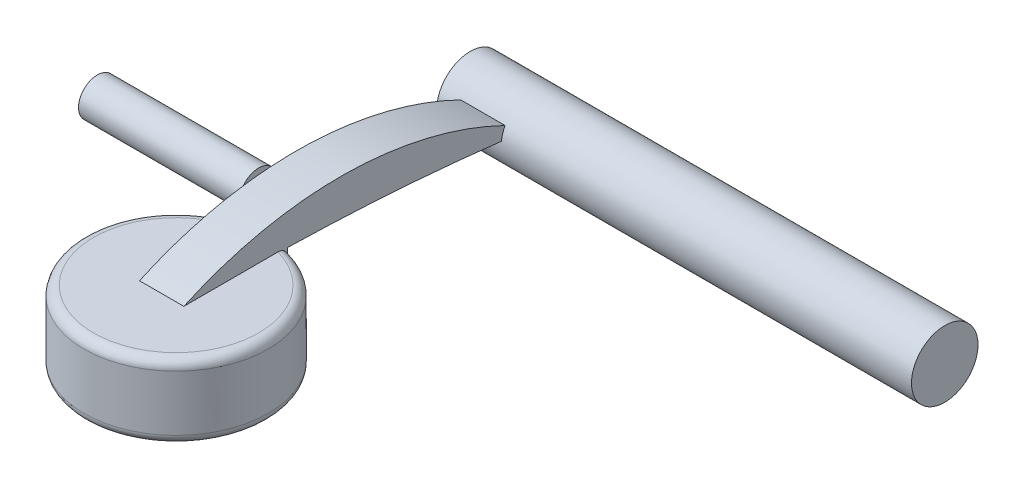
ISO-10303-21;
HEADER;
FILE_DESCRIPTION(('STEP AP214'),'2;1');
FILE_NAME('part.step','',(''),(''),'','','');
FILE_SCHEMA(('AUTOMOTIVE_DESIGN { 1 0 10303 214 1 1 1 1 }'));
ENDSEC;
DATA;
#1=APPLICATION_CONTEXT('core data for automotive mechanical design processes');
#2=APPLICATION_PROTOCOL_DEFINITION('international standard','automotive_design',2000,#1);
#3=PRODUCT_CONTEXT('',#1,'mechanical');
#4=PRODUCT('Part','Part','',(#3));
#5=PRODUCT_RELATED_PRODUCT_CATEGORY('part','',(#4));
#6=PRODUCT_DEFINITION_FORMATION('','',#4);
#7=PRODUCT_DEFINITION_CONTEXT('part definition',#1,'design');
#8=PRODUCT_DEFINITION('design','',#6,#7);
#9=PRODUCT_DEFINITION_SHAPE('','',#8);
#10=(LENGTH_UNIT() NAMED_UNIT(*) SI_UNIT(.MILLI.,.METRE.));
#11=(NAMED_UNIT(*) PLANE_ANGLE_UNIT() SI_UNIT($,.RADIAN.));
#12=(NAMED_UNIT(*) SI_UNIT($,.STERADIAN.) SOLID_ANGLE_UNIT());
#13=UNCERTAINTY_MEASURE_WITH_UNIT(LENGTH_MEASURE(1.E-05),#10,'distance_accuracy_value','');
#14=(GEOMETRIC_REPRESENTATION_CONTEXT(3) GLOBAL_UNCERTAINTY_ASSIGNED_CONTEXT((#13)) GLOBAL_UNIT_ASSIGNED_CONTEXT((#10,
#11,#12)) REPRESENTATION_CONTEXT('',''));
#15=CARTESIAN_POINT('',(0.,0.,0.));
#16=DIRECTION('',(0.,0.,1.));
#17=DIRECTION('',(1.,0.,0.));
#18=AXIS2_PLACEMENT_3D('',#15,#16,#17);
#19=CARTESIAN_POINT('',(4.3434,-21.7507796027201,13.1173010438083));
#20=DIRECTION('',(-1.,0.,0.));
#21=DIRECTION('',(0.,0.,1.));
#22=AXIS2_PLACEMENT_3D('',#19,#20,#21);
#23=CYLINDRICAL_SURFACE('',#22,25.4);
#24=DIRECTION('',(-1.,0.,0.));
#25=VECTOR('',#24,1.);
#26=CARTESIAN_POINT('',(4.34340000000016,1.34619999999997,23.6856279327502));
#27=LINE('',#26,#25);
#28=CARTESIAN_POINT('',(4.3434,1.34619999999996,23.6856279327502));
#29=VERTEX_POINT('',#28);
#30=CARTESIAN_POINT('',(1.3462,1.34619999999999,23.6856279327502));
#31=VERTEX_POINT('',#30);
#32=EDGE_CURVE('E127',#29,#31,#27,.T.);
#33=ORIENTED_EDGE('',*,*,#32,.F.);
#34=CARTESIAN_POINT('',(4.3434,-21.7507796027201,13.1173010438083));
#35=DIRECTION('',(1.,0.,0.));
#36=DIRECTION('',(0.,0.,-1.));
#37=AXIS2_PLACEMENT_3D('',#34,#35,#36);
#38=CIRCLE('',#37,25.4);
#39=CARTESIAN_POINT('',(4.3434,1.07456527479049,1.97442748162966));
#40=VERTEX_POINT('',#39);
#41=EDGE_CURVE('E144',#40,#29,#38,.T.);
#42=ORIENTED_EDGE('',*,*,#41,.F.);
#43=DIRECTION('',(-1.,0.,0.));
#44=VECTOR('',#43,1.);
#45=CARTESIAN_POINT('',(2.8448,1.0745652747905,1.97442748162966));
#46=LINE('',#45,#44);
#47=CARTESIAN_POINT('',(1.3462,1.0745652747905,1.97442748162966));
#48=VERTEX_POINT('',#47);
#49=EDGE_CURVE('E207',#40,#48,#46,.T.);
#50=ORIENTED_EDGE('',*,*,#49,.T.);
#51=CARTESIAN_POINT('',(1.3462,-21.7507796027201,13.1173010438083));
#52=DIRECTION('',(1.,0.,0.));
#53=DIRECTION('',(0.,0.,-1.));
#54=AXIS2_PLACEMENT_3D('',#51,#52,#53);
#55=CIRCLE('',#54,25.4);
#56=CARTESIAN_POINT('',(1.3462,3.59411581860612,14.7895079933323));
#57=VERTEX_POINT('',#56);
#58=EDGE_CURVE('E106',#48,#57,#55,.T.);
#59=ORIENTED_EDGE('',*,*,#58,.T.);
#60=CARTESIAN_POINT('',(1.3462,3.40039726745053,16.663891243619));
#61=VERTEX_POINT('',#60);
#62=EDGE_CURVE('E102',#57,#61,#55,.T.);
#63=ORIENTED_EDGE('',*,*,#62,.T.);
#64=EDGE_CURVE('E103',#61,#31,#55,.T.);
#65=ORIENTED_EDGE('',*,*,#64,.T.);
#66=EDGE_LOOP('',(#33,#42,#50,#59,#63,#65));
#67=FACE_BOUND('',#66,.T.);
#68=ADVANCED_FACE('F39',(#67),#23,.T.);
#69=CARTESIAN_POINT('',(4.3434,-151.081445800467,20.0039179872453));
#70=DIRECTION('',(-1.,0.,0.));
#71=DIRECTION('',(0.,0.,1.));
#72=AXIS2_PLACEMENT_3D('',#69,#70,#71);
#73=CYLINDRICAL_SURFACE('',#72,152.4);
#74=CARTESIAN_POINT('',(1.34620000000106,1.282033768533,16.667738491654));
#75=CARTESIAN_POINT('',(1.51765032495201,1.2810995876091,16.6251779736917));
#76=CARTESIAN_POINT('',(1.69092174834798,1.28031269019583,16.5899559722769));
#77=CARTESIAN_POINT('',(2.03989821390831,1.27905778264743,16.5343491572366));
#78=CARTESIAN_POINT('',(2.21560415329253,1.27858989345131,16.5139699704619));
#79=CARTESIAN_POINT('',(2.56457948471818,1.27800399390558,16.4884990793644));
#80=CARTESIAN_POINT('',(2.73782720326946,1.27787916434063,16.4831093927537));
#81=CARTESIAN_POINT('',(3.08408808934924,1.27796430758188,16.4867939584811));
#82=CARTESIAN_POINT('',(3.25710133065433,1.27817411403033,16.4958610239272));
#83=CARTESIAN_POINT('',(3.58271564193875,1.27887843722038,16.5265877311974));
#84=CARTESIAN_POINT('',(3.73546041971656,1.27933894465162,16.5467457538455));
#85=CARTESIAN_POINT('',(4.04041434459244,1.28050512953281,16.5985570928081));
#86=CARTESIAN_POINT('',(4.1926060371779,1.28121299499684,16.6303131167953));
#87=CARTESIAN_POINT('',(4.34340000000104,1.282033768533,16.6677384916542));
#88=B_SPLINE_CURVE_WITH_KNOTS('',3,(#74,#75,#76,#77,#78,#79,#80,#81,#82,#83,#84,#85,#86,#87),
.UNSPECIFIED.,.F.,.F.,(4,2,2,2,2,2,4),(0.,0.529808905443831,1.05981855489802,1.57921393637987,
2.09835119108104,2.56014411099233,3.02612979371629),.UNSPECIFIED.);
#89=CARTESIAN_POINT('',(1.34620000000106,1.282033768533,16.667738491654));
#90=VERTEX_POINT('',#89);
#91=CARTESIAN_POINT('',(4.34340000000106,1.282033768533,16.667738491654));
#92=VERTEX_POINT('',#91);
#93=EDGE_CURVE('E117',#90,#92,#88,.T.);
#94=ORIENTED_EDGE('',*,*,#93,.F.);
#95=CARTESIAN_POINT('',(1.3462,-151.081445800467,20.0039179872453));
#96=DIRECTION('',(-1.,0.,0.));
#97=DIRECTION('',(0.,0.,-1.));
#98=AXIS2_PLACEMENT_3D('',#95,#96,#97);
#99=CIRCLE('',#98,152.4);
#100=CARTESIAN_POINT('',(1.3462,0.278614937488098,2.23056677250751));
#101=VERTEX_POINT('',#100);
#102=EDGE_CURVE('E227',#90,#101,#99,.T.);
#103=ORIENTED_EDGE('',*,*,#102,.T.);
#104=DIRECTION('',(-1.,0.,0.));
#105=VECTOR('',#104,1.);
#106=CARTESIAN_POINT('',(2.84480000000001,0.278614937487931,2.23056677250617));
#107=LINE('',#106,#105);
#108=CARTESIAN_POINT('',(4.3434,0.278614937487931,2.23056677250617));
#109=VERTEX_POINT('',#108);
#110=EDGE_CURVE('E210',#101,#109,#107,.F.);
#111=ORIENTED_EDGE('',*,*,#110,.T.);
#112=CARTESIAN_POINT('',(4.3434,-151.081445800467,20.0039179872453));
#113=DIRECTION('',(-1.,0.,0.));
#114=DIRECTION('',(0.,0.,-1.));
#115=AXIS2_PLACEMENT_3D('',#112,#113,#114);
#116=CIRCLE('',#115,152.4);
#117=EDGE_CURVE('E223',#92,#109,#116,.T.);
#118=ORIENTED_EDGE('',*,*,#117,.F.);
#119=EDGE_LOOP('',(#94,#103,#111,#118));
#120=FACE_BOUND('',#119,.T.);
#121=ADVANCED_FACE('F146',(#120),#73,.F.);
#122=CARTESIAN_POINT('',(4.3434,-86.4161127015938,16.5606095155268));
#123=DIRECTION('',(1.,0.,0.));
#124=DIRECTION('',(0.,0.,-1.));
#125=AXIS2_PLACEMENT_3D('',#122,#123,#124);
#126=PLANE('',#125);
#127=DIRECTION('',(0.,0.,-1.));
#128=VECTOR('',#127,1.);
#129=CARTESIAN_POINT('',(4.3434,1.34619999999996,16.5606095155268));
#130=LINE('',#129,#128);
#131=CARTESIAN_POINT('',(4.3434,1.34619999999997,17.3242978498323));
#132=VERTEX_POINT('',#131);
#133=EDGE_CURVE('E132',#29,#132,#130,.T.);
#134=ORIENTED_EDGE('',*,*,#133,.T.);
#135=CARTESIAN_POINT('',(4.3434,1.34619999999997,17.3242978498323));
#136=CARTESIAN_POINT('',(4.3434,1.34622701712877,17.2863630580683));
#137=CARTESIAN_POINT('',(4.3434,1.34304642401105,17.2484251184867));
#138=CARTESIAN_POINT('',(4.3434,1.33042637800358,17.1735907658505));
#139=CARTESIAN_POINT('',(4.3434,1.32098456657357,17.1366947507414));
#140=CARTESIAN_POINT('',(4.3434,1.29598608611235,17.0649861899526));
#141=CARTESIAN_POINT('',(4.3434,1.2804232708102,17.0301757790982));
#142=CARTESIAN_POINT('',(4.3434,1.24356057386874,16.9637523441756));
#143=CARTESIAN_POINT('',(4.3434,1.2222634380339,16.932137799748));
#144=CARTESIAN_POINT('',(4.3434,1.17497020357583,16.8737146573782));
#145=CARTESIAN_POINT('',(4.3434,1.14907990355565,16.8468204965631));
#146=CARTESIAN_POINT('',(4.3434,1.09301785477377,16.7979374974672));
#147=CARTESIAN_POINT('',(4.3434,1.06284670037762,16.7759479793008));
#148=CARTESIAN_POINT('',(4.3434,1.00013162592213,16.7382507849021));
#149=CARTESIAN_POINT('',(4.3434,0.967695870480399,16.7223630937333));
#150=CARTESIAN_POINT('',(4.3434,0.900567678194986,16.6964200428946));
#151=CARTESIAN_POINT('',(4.3434,0.865875492545732,16.6863640352509));
#152=CARTESIAN_POINT('',(4.3434,0.796204207817927,16.6726275634973));
#153=CARTESIAN_POINT('',(4.3434,0.76125677648708,16.6687860306265));
#154=CARTESIAN_POINT('',(4.3434,0.691171176601259,16.6670567457441));
#155=CARTESIAN_POINT('',(4.3434,0.656032819473581,16.6691767207831));
#156=CARTESIAN_POINT('',(4.3434,0.621327959022227,16.6743245171727));
#157=B_SPLINE_CURVE_WITH_KNOTS('',3,(#135,#136,#137,#138,#139,#140,#141,#142,#143,#144,#145,
#146,#147,#148,#149,#150,#151,#152,#153,#154,#155,#156),.UNSPECIFIED.,.F.,.F.,(4,2,2,2,2,2,2,2,
2,2,4),(0.,0.11367736379813,0.227397573100123,0.341232264770766,0.455012544826278,
0.566449720011125,0.677871438066521,0.785693022411391,0.893502624122314,0.998470422900659,
1.10357433912353),.UNSPECIFIED.);
#158=CARTESIAN_POINT('',(4.34340000000003,0.71119999999997,16.667738491654));
#159=VERTEX_POINT('',#158);
#160=EDGE_CURVE('E49',#132,#159,#157,.T.);
#161=ORIENTED_EDGE('',*,*,#160,.T.);
#162=DIRECTION('',(0.,1.,0.));
#163=VECTOR('',#162,1.);
#164=CARTESIAN_POINT('',(4.3434,-3.68300000000002,16.667738491654));
#165=LINE('',#164,#163);
#166=EDGE_CURVE('E62',#92,#159,#165,.F.);
#167=ORIENTED_EDGE('',*,*,#166,.F.);
#168=ORIENTED_EDGE('',*,*,#117,.T.);
#169=CARTESIAN_POINT('',(4.3434,0.,0.));
#170=DIRECTION('',(1.,0.,0.));
#171=DIRECTION('',(0.,0.,-1.));
#172=AXIS2_PLACEMENT_3D('',#169,#170,#171);
#173=CIRCLE('',#172,2.2479);
#174=EDGE_CURVE('E203',#40,#109,#173,.T.);
#175=ORIENTED_EDGE('',*,*,#174,.F.);
#176=ORIENTED_EDGE('',*,*,#41,.T.);
#177=EDGE_LOOP('',(#134,#161,#167,#168,#175,#176));
#178=FACE_BOUND('',#177,.T.);
#179=ADVANCED_FACE('F160',(#178),#126,.T.);
#180=CARTESIAN_POINT('',(1.3462,-86.4161127015938,16.5606095155268));
#181=DIRECTION('',(1.,0.,0.));
#182=DIRECTION('',(0.,0.,-1.));
#183=AXIS2_PLACEMENT_3D('',#180,#181,#182);
#184=PLANE('',#183);
#185=CARTESIAN_POINT('',(1.3462,2.65018747786347,15.6391545595837));
#186=DIRECTION('',(1.,0.,0.));
#187=DIRECTION('',(0.,0.,-1.));
#188=AXIS2_PLACEMENT_3D('',#185,#186,#187);
#189=CIRCLE('',#188,1.27);
#190=EDGE_CURVE('E11',#57,#61,#189,.F.);
#191=ORIENTED_EDGE('',*,*,#190,.F.);
#192=ORIENTED_EDGE('',*,*,#58,.F.);
#193=CARTESIAN_POINT('',(1.3462,0.,0.));
#194=DIRECTION('',(1.,0.,0.));
#195=DIRECTION('',(0.,0.,-1.));
#196=AXIS2_PLACEMENT_3D('',#193,#194,#195);
#197=CIRCLE('',#196,2.2479);
#198=EDGE_CURVE('E214',#48,#101,#197,.T.);
#199=ORIENTED_EDGE('',*,*,#198,.T.);
#200=ORIENTED_EDGE('',*,*,#102,.F.);
#201=DIRECTION('',(0.,1.,0.));
#202=VECTOR('',#201,1.);
#203=CARTESIAN_POINT('',(1.3462,-3.68300000000002,16.667738491654));
#204=LINE('',#203,#202);
#205=CARTESIAN_POINT('',(1.3462,0.711199999999991,16.667738491654));
#206=VERTEX_POINT('',#205);
#207=EDGE_CURVE('E184',#206,#90,#204,.T.);
#208=ORIENTED_EDGE('',*,*,#207,.F.);
#209=CARTESIAN_POINT('',(1.3462,1.34619999999999,17.3242978498323));
#210=CARTESIAN_POINT('',(1.3462,1.34622701712879,17.2863630580683));
#211=CARTESIAN_POINT('',(1.3462,1.34304642401108,17.2484251184867));
#212=CARTESIAN_POINT('',(1.3462,1.3304263780036,17.1735907658505));
#213=CARTESIAN_POINT('',(1.3462,1.3209845665736,17.1366947507414));
#214=CARTESIAN_POINT('',(1.3462,1.29598608611237,17.0649861899526));
#215=CARTESIAN_POINT('',(1.3462,1.28042327081022,17.0301757790982));
#216=CARTESIAN_POINT('',(1.3462,1.24356057386876,16.9637523441756));
#217=CARTESIAN_POINT('',(1.3462,1.22226343803392,16.932137799748));
#218=CARTESIAN_POINT('',(1.3462,1.17497020357585,16.8737146573782));
#219=CARTESIAN_POINT('',(1.3462,1.14907990355567,16.8468204965631));
#220=CARTESIAN_POINT('',(1.3462,1.09301785477379,16.7979374974672));
#221=CARTESIAN_POINT('',(1.3462,1.06284670037764,16.7759479793008));
#222=CARTESIAN_POINT('',(1.3462,1.00013162592215,16.7382507849021));
#223=CARTESIAN_POINT('',(1.3462,0.967695870480419,16.7223630937333));
#224=CARTESIAN_POINT('',(1.3462,0.900567678195005,16.6964200428945));
#225=CARTESIAN_POINT('',(1.3462,0.86587549254575,16.6863640352509));
#226=CARTESIAN_POINT('',(1.3462,0.796204207817944,16.6726275634973));
#227=CARTESIAN_POINT('',(1.3462,0.761256776487098,16.6687860306265));
#228=CARTESIAN_POINT('',(1.3462,0.691171176601277,16.6670567457441));
#229=CARTESIAN_POINT('',(1.3462,0.6560328194736,16.6691767207831));
#230=CARTESIAN_POINT('',(1.3462,0.621327959022246,16.6743245171727));
#231=B_SPLINE_CURVE_WITH_KNOTS('',3,(#209,#210,#211,#212,#213,#214,#215,#216,#217,#218,#219,
#220,#221,#222,#223,#224,#225,#226,#227,#228,#229,#230),.UNSPECIFIED.,.F.,.F.,(4,2,2,2,2,2,2,2,
2,2,4),(0.,0.11367736379813,0.227397573100124,0.341232264770766,0.455012544826278,
0.566449720011125,0.677871438066525,0.785693022411394,0.893502624122319,0.998470422900663,
1.10357433912353),.UNSPECIFIED.);
#232=CARTESIAN_POINT('',(1.3462,1.34619999999999,17.3242978498323));
#233=VERTEX_POINT('',#232);
#234=EDGE_CURVE('E170',#206,#233,#231,.F.);
#235=ORIENTED_EDGE('',*,*,#234,.T.);
#236=DIRECTION('',(0.,0.,-1.));
#237=VECTOR('',#236,1.);
#238=CARTESIAN_POINT('',(1.3462,1.34619999999999,16.5606095155268));
#239=LINE('',#238,#237);
#240=EDGE_CURVE('E114',#31,#233,#239,.T.);
#241=ORIENTED_EDGE('',*,*,#240,.F.);
#242=ORIENTED_EDGE('',*,*,#64,.F.);
#243=EDGE_LOOP('',(#191,#192,#199,#200,#208,#235,#241,#242));
#244=FACE_BOUND('',#243,.T.);
#245=ADVANCED_FACE('F112',(#244),#184,.F.);
#246=CARTESIAN_POINT('',(32.0802,0.,0.));
#247=DIRECTION('',(-1.,0.,0.));
#248=DIRECTION('',(0.,0.,1.));
#249=AXIS2_PLACEMENT_3D('',#246,#247,#248);
#250=CYLINDRICAL_SURFACE('',#249,2.2479);
#251=ORIENTED_EDGE('',*,*,#49,.F.);
#252=ORIENTED_EDGE('',*,*,#174,.T.);
#253=ORIENTED_EDGE('',*,*,#110,.F.);
#254=ORIENTED_EDGE('',*,*,#198,.F.);
#255=EDGE_LOOP('',(#251,#252,#253,#254));
#256=FACE_BOUND('',#255,.T.);
#257=CARTESIAN_POINT('',(32.0802,0.,0.));
#258=DIRECTION('',(1.,0.,0.));
#259=DIRECTION('',(0.,0.,-1.));
#260=AXIS2_PLACEMENT_3D('',#257,#258,#259);
#261=CIRCLE('',#260,2.2479);
#262=CARTESIAN_POINT('',(32.0802,0.,-2.2479));
#263=VERTEX_POINT('',#262);
#264=EDGE_CURVE('E218',#263,#263,#261,.T.);
#265=ORIENTED_EDGE('',*,*,#264,.F.);
#266=EDGE_LOOP('',(#265));
#267=FACE_BOUND('',#266,.T.);
#268=CARTESIAN_POINT('',(0.,0.,0.));
#269=DIRECTION('',(1.,0.,0.));
#270=DIRECTION('',(0.,0.,-1.));
#271=AXIS2_PLACEMENT_3D('',#268,#269,#270);
#272=CIRCLE('',#271,2.2479);
#273=CARTESIAN_POINT('',(0.,0.,-2.2479));
#274=VERTEX_POINT('',#273);
#275=EDGE_CURVE('E219',#274,#274,#272,.T.);
#276=ORIENTED_EDGE('',*,*,#275,.T.);
#277=EDGE_LOOP('',(#276));
#278=FACE_BOUND('',#277,.T.);
#279=ADVANCED_FACE('F249',(#256,#267,#278),#250,.T.);
#280=CARTESIAN_POINT('',(32.0802,0.,0.));
#281=DIRECTION('',(1.,0.,0.));
#282=DIRECTION('',(0.,0.,-1.));
#283=AXIS2_PLACEMENT_3D('',#280,#281,#282);
#284=PLANE('',#283);
#285=ORIENTED_EDGE('',*,*,#264,.T.);
#286=EDGE_LOOP('',(#285));
#287=FACE_BOUND('',#286,.T.);
#288=ADVANCED_FACE('F252',(#287),#284,.T.);
#289=CARTESIAN_POINT('',(0.,0.,0.));
#290=DIRECTION('',(1.,0.,0.));
#291=DIRECTION('',(0.,0.,-1.));
#292=AXIS2_PLACEMENT_3D('',#289,#290,#291);
#293=PLANE('',#292);
#294=ORIENTED_EDGE('',*,*,#275,.F.);
#295=EDGE_LOOP('',(#294));
#296=FACE_BOUND('',#295,.T.);
#297=ADVANCED_FACE('F156',(#296),#293,.F.);
#298=CARTESIAN_POINT('',(2.84479999999997,-3.68300000000002,22.7076));
#299=DIRECTION('',(0.,1.,0.));
#300=DIRECTION('',(-1.,0.,0.));
#301=AXIS2_PLACEMENT_3D('',#298,#299,#300);
#302=CYLINDRICAL_SURFACE('',#301,6.223);
#303=CARTESIAN_POINT('',(2.84479999999997,-3.04800000000002,22.7076));
#304=DIRECTION('',(0.,-1.,0.));
#305=DIRECTION('',(1.,0.,0.));
#306=AXIS2_PLACEMENT_3D('',#303,#304,#305);
#307=CIRCLE('',#306,6.223);
#308=CARTESIAN_POINT('',(9.06779999999997,-3.04800000000006,22.7076));
#309=VERTEX_POINT('',#308);
#310=EDGE_CURVE('E180',#309,#309,#307,.F.);
#311=ORIENTED_EDGE('',*,*,#310,.T.);
#312=EDGE_LOOP('',(#311));
#313=FACE_BOUND('',#312,.T.);
#314=CARTESIAN_POINT('',(2.8448,0.71119999999998,22.7076));
#315=DIRECTION('',(0.,-1.,0.));
#316=DIRECTION('',(1.,0.,0.));
#317=AXIS2_PLACEMENT_3D('',#314,#315,#316);
#318=CIRCLE('',#317,6.223);
#319=CARTESIAN_POINT('',(4.51369545454545,0.711199999999963,16.7125589691315));
#320=VERTEX_POINT('',#319);
#321=EDGE_CURVE('E187',#320,#206,#318,.T.);
#322=ORIENTED_EDGE('',*,*,#321,.T.);
#323=ORIENTED_EDGE('',*,*,#207,.T.);
#324=ORIENTED_EDGE('',*,*,#93,.T.);
#325=ORIENTED_EDGE('',*,*,#166,.T.);
#326=CARTESIAN_POINT('',(2.8448,0.71119999999998,22.7076));
#327=DIRECTION('',(0.,-1.,0.));
#328=DIRECTION('',(1.,0.,0.));
#329=AXIS2_PLACEMENT_3D('',#326,#327,#328);
#330=CIRCLE('',#329,6.223);
#331=EDGE_CURVE('E191',#159,#320,#330,.T.);
#332=ORIENTED_EDGE('',*,*,#331,.T.);
#333=EDGE_LOOP('',(#322,#323,#324,#325,#332));
#334=FACE_BOUND('',#333,.T.);
#335=ADVANCED_FACE('F150',(#313,#334),#302,.T.);
#336=CARTESIAN_POINT('',(2.84479999999997,-3.68300000000002,22.7076));
#337=DIRECTION('',(0.,-1.,0.));
#338=DIRECTION('',(1.,0.,0.));
#339=AXIS2_PLACEMENT_3D('',#336,#337,#338);
#340=PLANE('',#339);
#341=CARTESIAN_POINT('',(2.84479999999997,-3.68300000000002,22.7076));
#342=DIRECTION('',(0.,-1.,0.));
#343=DIRECTION('',(1.,0.,0.));
#344=AXIS2_PLACEMENT_3D('',#341,#342,#343);
#345=CIRCLE('',#344,5.588);
#346=CARTESIAN_POINT('',(8.43279999999996,-3.68300000000006,22.7076));
#347=VERTEX_POINT('',#346);
#348=EDGE_CURVE('E197',#347,#347,#345,.T.);
#349=ORIENTED_EDGE('',*,*,#348,.T.);
#350=EDGE_LOOP('',(#349));
#351=FACE_BOUND('',#350,.T.);
#352=ADVANCED_FACE('F155',(#351),#340,.T.);
#353=CARTESIAN_POINT('',(2.8448,1.34619999999998,22.7076));
#354=DIRECTION('',(0.,-1.,0.));
#355=DIRECTION('',(1.,0.,0.));
#356=AXIS2_PLACEMENT_3D('',#353,#354,#355);
#357=PLANE('',#356);
#358=ORIENTED_EDGE('',*,*,#240,.T.);
#359=CARTESIAN_POINT('',(2.8448,1.34619999999998,22.7076));
#360=DIRECTION('',(0.,-1.,0.));
#361=DIRECTION('',(1.,0.,0.));
#362=AXIS2_PLACEMENT_3D('',#359,#360,#361);
#363=CIRCLE('',#362,5.588);
#364=EDGE_CURVE('E177',#233,#132,#363,.F.);
#365=ORIENTED_EDGE('',*,*,#364,.T.);
#366=ORIENTED_EDGE('',*,*,#133,.F.);
#367=ORIENTED_EDGE('',*,*,#32,.T.);
#368=EDGE_LOOP('',(#358,#365,#366,#367));
#369=FACE_BOUND('',#368,.T.);
#370=ADVANCED_FACE('F158',(#369),#357,.F.);
#371=CARTESIAN_POINT('',(2.84479999999997,-3.04800000000002,22.7076));
#372=DIRECTION('',(0.,-1.,0.));
#373=DIRECTION('',(1.,0.,0.));
#374=AXIS2_PLACEMENT_3D('',#371,#372,#373);
#375=TOROIDAL_SURFACE('',#374,5.588,0.635);
#376=ORIENTED_EDGE('',*,*,#310,.F.);
#377=EDGE_LOOP('',(#376));
#378=FACE_BOUND('',#377,.T.);
#379=ORIENTED_EDGE('',*,*,#348,.F.);
#380=EDGE_LOOP('',(#379));
#381=FACE_BOUND('',#380,.T.);
#382=ADVANCED_FACE('F326',(#378,#381),#375,.T.);
#383=CARTESIAN_POINT('',(2.8448,0.71119999999998,22.7076));
#384=DIRECTION('',(0.,-1.,0.));
#385=DIRECTION('',(1.,0.,0.));
#386=AXIS2_PLACEMENT_3D('',#383,#384,#385);
#387=TOROIDAL_SURFACE('',#386,5.588,0.635);
#388=ORIENTED_EDGE('',*,*,#160,.F.);
#389=ORIENTED_EDGE('',*,*,#364,.F.);
#390=ORIENTED_EDGE('',*,*,#234,.F.);
#391=ORIENTED_EDGE('',*,*,#321,.F.);
#392=ORIENTED_EDGE('',*,*,#331,.F.);
#393=EDGE_LOOP('',(#388,#389,#390,#391,#392));
#394=FACE_BOUND('',#393,.T.);
#395=ADVANCED_FACE('F41',(#394),#387,.T.);
#396=CARTESIAN_POINT('',(-9.5504,2.65018747786347,15.6391545595837));
#397=DIRECTION('',(1.,0.,0.));
#398=DIRECTION('',(0.,0.,-1.));
#399=AXIS2_PLACEMENT_3D('',#396,#397,#398);
#400=CYLINDRICAL_SURFACE('',#399,1.27);
#401=CARTESIAN_POINT('',(-9.5504,2.65018747786347,15.6391545595837));
#402=DIRECTION('',(-1.,0.,0.));
#403=DIRECTION('',(0.,0.,1.));
#404=AXIS2_PLACEMENT_3D('',#401,#402,#403);
#405=CIRCLE('',#404,1.27);
#406=CARTESIAN_POINT('',(-9.5504,2.65018747786347,16.9091545595837));
#407=VERTEX_POINT('',#406);
#408=EDGE_CURVE('E123',#407,#407,#405,.T.);
#409=ORIENTED_EDGE('',*,*,#408,.F.);
#410=EDGE_LOOP('',(#409));
#411=FACE_BOUND('',#410,.T.);
#412=CARTESIAN_POINT('',(1.3462,2.65018747786347,15.6391545595837));
#413=DIRECTION('',(-1.,0.,0.));
#414=DIRECTION('',(0.,0.,1.));
#415=AXIS2_PLACEMENT_3D('',#412,#413,#414);
#416=CIRCLE('',#415,1.27);
#417=EDGE_CURVE('E120',#61,#57,#416,.T.);
#418=ORIENTED_EDGE('',*,*,#417,.T.);
#419=ORIENTED_EDGE('',*,*,#190,.T.);
#420=EDGE_LOOP('',(#418,#419));
#421=FACE_BOUND('',#420,.T.);
#422=ADVANCED_FACE('F119',(#411,#421),#400,.T.);
#423=CARTESIAN_POINT('',(-9.5504,2.65018747786347,15.6391545595837));
#424=DIRECTION('',(-1.,0.,0.));
#425=DIRECTION('',(0.,0.,1.));
#426=AXIS2_PLACEMENT_3D('',#423,#424,#425);
#427=PLANE('',#426);
#428=ORIENTED_EDGE('',*,*,#408,.T.);
#429=EDGE_LOOP('',(#428));
#430=FACE_BOUND('',#429,.T.);
#431=ADVANCED_FACE('F344',(#430),#427,.T.);
#432=CARTESIAN_POINT('',(1.3462,2.65018747786347,15.6391545595837));
#433=DIRECTION('',(-1.,0.,0.));
#434=DIRECTION('',(0.,0.,1.));
#435=AXIS2_PLACEMENT_3D('',#432,#433,#434);
#436=PLANE('',#435);
#437=ORIENTED_EDGE('',*,*,#417,.F.);
#438=ORIENTED_EDGE('',*,*,#62,.F.);
#439=EDGE_LOOP('',(#437,#438));
#440=FACE_BOUND('',#439,.T.);
#441=ADVANCED_FACE('F121',(#440),#436,.F.);
#442=CLOSED_SHELL('',(#68,#121,#179,#245,#279,#288,#297,#335,#352,#370,#382,#395,#422,#431,#441));
#443=MANIFOLD_SOLID_BREP('B2',#442);
#444=ADVANCED_BREP_SHAPE_REPRESENTATION('',(#18,#443),#14);
#445=SHAPE_DEFINITION_REPRESENTATION(#9,#444);
ENDSEC;
END-ISO-10303-21;
